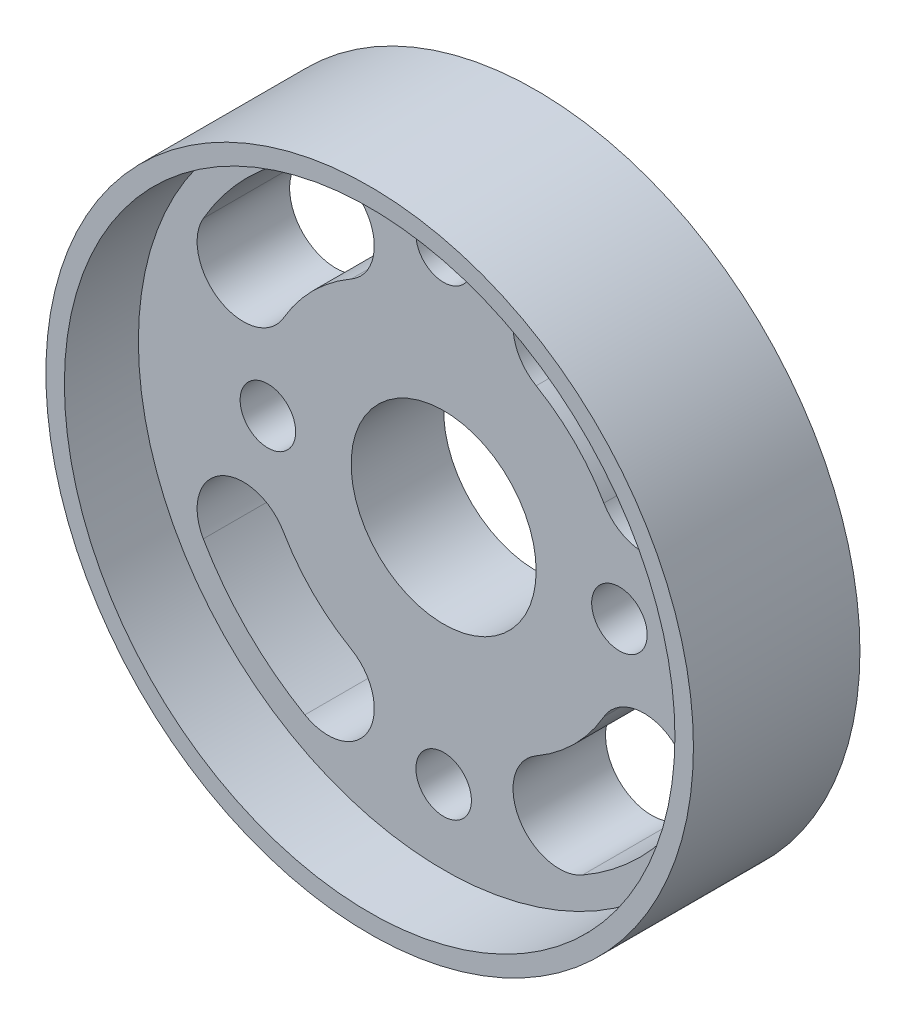
ISO-10303-21;
HEADER;
FILE_DESCRIPTION(('STEP AP214'),'2;1');
FILE_NAME('part.step','',(''),(''),'','','');
FILE_SCHEMA(('AUTOMOTIVE_DESIGN { 1 0 10303 214 1 1 1 1 }'));
ENDSEC;
DATA;
#1=APPLICATION_CONTEXT('core data for automotive mechanical design processes');
#2=APPLICATION_PROTOCOL_DEFINITION('international standard','automotive_design',2000,#1);
#3=PRODUCT_CONTEXT('',#1,'mechanical');
#4=PRODUCT('Part','Part','',(#3));
#5=PRODUCT_RELATED_PRODUCT_CATEGORY('part','',(#4));
#6=PRODUCT_DEFINITION_FORMATION('','',#4);
#7=PRODUCT_DEFINITION_CONTEXT('part definition',#1,'design');
#8=PRODUCT_DEFINITION('design','',#6,#7);
#9=PRODUCT_DEFINITION_SHAPE('','',#8);
#10=(LENGTH_UNIT() NAMED_UNIT(*) SI_UNIT(.MILLI.,.METRE.));
#11=(NAMED_UNIT(*) PLANE_ANGLE_UNIT() SI_UNIT($,.RADIAN.));
#12=(NAMED_UNIT(*) SI_UNIT($,.STERADIAN.) SOLID_ANGLE_UNIT());
#13=UNCERTAINTY_MEASURE_WITH_UNIT(LENGTH_MEASURE(1.E-05),#10,'distance_accuracy_value','');
#14=(GEOMETRIC_REPRESENTATION_CONTEXT(3) GLOBAL_UNCERTAINTY_ASSIGNED_CONTEXT((#13)) GLOBAL_UNIT_ASSIGNED_CONTEXT((#10,
#11,#12)) REPRESENTATION_CONTEXT('',''));
#15=CARTESIAN_POINT('',(0.,0.,0.));
#16=DIRECTION('',(0.,0.,1.));
#17=DIRECTION('',(1.,0.,0.));
#18=AXIS2_PLACEMENT_3D('',#15,#16,#17);
#19=CARTESIAN_POINT('',(0.,0.,5.));
#20=DIRECTION('',(0.,0.,1.));
#21=DIRECTION('',(1.,0.,0.));
#22=AXIS2_PLACEMENT_3D('',#19,#20,#21);
#23=PLANE('',#22);
#24=CARTESIAN_POINT('',(-9.5,0.,5.));
#25=DIRECTION('',(0.,0.,1.));
#26=DIRECTION('',(1.,0.,0.));
#27=AXIS2_PLACEMENT_3D('',#24,#25,#26);
#28=CIRCLE('',#27,1.5);
#29=CARTESIAN_POINT('',(-8.,0.,5.));
#30=VERTEX_POINT('',#29);
#31=EDGE_CURVE('E325',#30,#30,#28,.T.);
#32=ORIENTED_EDGE('',*,*,#31,.F.);
#33=EDGE_LOOP('',(#32));
#34=FACE_BOUND('',#33,.T.);
#35=CARTESIAN_POINT('',(6.25000000000001,10.8253175473055,5.));
#36=DIRECTION('',(0.,0.,1.));
#37=DIRECTION('',(-1.,0.,0.));
#38=AXIS2_PLACEMENT_3D('',#35,#36,#37);
#39=CIRCLE('',#38,2.5);
#40=CARTESIAN_POINT('',(7.50000000000001,12.9903810567666,5.));
#41=VERTEX_POINT('',#40);
#42=CARTESIAN_POINT('',(5.00000000000001,8.66025403784438,5.));
#43=VERTEX_POINT('',#42);
#44=EDGE_CURVE('E160',#41,#43,#39,.T.);
#45=ORIENTED_EDGE('',*,*,#44,.F.);
#46=CARTESIAN_POINT('',(0.,0.,5.));
#47=DIRECTION('',(0.,0.,1.));
#48=DIRECTION('',(1.,0.,0.));
#49=AXIS2_PLACEMENT_3D('',#46,#47,#48);
#50=CIRCLE('',#49,15.);
#51=CARTESIAN_POINT('',(12.9903810567668,7.49999999999964,5.));
#52=VERTEX_POINT('',#51);
#53=EDGE_CURVE('E152',#52,#41,#50,.T.);
#54=ORIENTED_EDGE('',*,*,#53,.F.);
#55=CARTESIAN_POINT('',(10.8253175473056,6.24999999999969,5.));
#56=DIRECTION('',(0.,0.,1.));
#57=DIRECTION('',(-1.,0.,0.));
#58=AXIS2_PLACEMENT_3D('',#55,#56,#57);
#59=CIRCLE('',#58,2.5);
#60=CARTESIAN_POINT('',(8.66025403784451,4.99999999999975,5.));
#61=VERTEX_POINT('',#60);
#62=EDGE_CURVE('E175',#61,#52,#59,.T.);
#63=ORIENTED_EDGE('',*,*,#62,.F.);
#64=CARTESIAN_POINT('',(0.,0.,5.));
#65=DIRECTION('',(0.,0.,-1.));
#66=DIRECTION('',(1.,0.,0.));
#67=AXIS2_PLACEMENT_3D('',#64,#65,#66);
#68=CIRCLE('',#67,10.);
#69=EDGE_CURVE('E173',#43,#61,#68,.T.);
#70=ORIENTED_EDGE('',*,*,#69,.F.);
#71=EDGE_LOOP('',(#45,#54,#63,#70));
#72=FACE_BOUND('',#71,.T.);
#73=CARTESIAN_POINT('',(6.24999999999979,-10.8253175473056,5.));
#74=DIRECTION('',(0.,0.,1.));
#75=DIRECTION('',(1.,0.,0.));
#76=AXIS2_PLACEMENT_3D('',#73,#74,#75);
#77=CIRCLE('',#76,2.5);
#78=CARTESIAN_POINT('',(4.99999999999983,-8.66025403784448,5.));
#79=VERTEX_POINT('',#78);
#80=CARTESIAN_POINT('',(7.49999999999975,-12.9903810567667,5.));
#81=VERTEX_POINT('',#80);
#82=EDGE_CURVE('E193',#79,#81,#77,.T.);
#83=ORIENTED_EDGE('',*,*,#82,.F.);
#84=CARTESIAN_POINT('',(0.,0.,5.));
#85=DIRECTION('',(0.,0.,-1.));
#86=DIRECTION('',(1.,0.,0.));
#87=AXIS2_PLACEMENT_3D('',#84,#85,#86);
#88=CIRCLE('',#87,10.);
#89=CARTESIAN_POINT('',(8.66025403784442,-4.99999999999995,5.));
#90=VERTEX_POINT('',#89);
#91=EDGE_CURVE('E191',#90,#79,#88,.T.);
#92=ORIENTED_EDGE('',*,*,#91,.F.);
#93=CARTESIAN_POINT('',(10.8253175473055,-6.24999999999993,5.));
#94=DIRECTION('',(0.,0.,1.));
#95=DIRECTION('',(1.,0.,0.));
#96=AXIS2_PLACEMENT_3D('',#93,#94,#95);
#97=CIRCLE('',#96,2.5);
#98=CARTESIAN_POINT('',(12.9903810567666,-7.49999999999991,5.));
#99=VERTEX_POINT('',#98);
#100=EDGE_CURVE('E199',#99,#90,#97,.T.);
#101=ORIENTED_EDGE('',*,*,#100,.F.);
#102=CARTESIAN_POINT('',(0.,0.,5.));
#103=DIRECTION('',(0.,0.,1.));
#104=DIRECTION('',(1.,0.,0.));
#105=AXIS2_PLACEMENT_3D('',#102,#103,#104);
#106=CIRCLE('',#105,15.);
#107=EDGE_CURVE('E196',#81,#99,#106,.T.);
#108=ORIENTED_EDGE('',*,*,#107,.F.);
#109=EDGE_LOOP('',(#83,#92,#101,#108));
#110=FACE_BOUND('',#109,.T.);
#111=CARTESIAN_POINT('',(0.,0.,5.));
#112=DIRECTION('',(0.,0.,1.));
#113=DIRECTION('',(1.,0.,0.));
#114=AXIS2_PLACEMENT_3D('',#111,#112,#113);
#115=CIRCLE('',#114,15.);
#116=CARTESIAN_POINT('',(-12.9903810567666,-7.49999999999991,5.));
#117=VERTEX_POINT('',#116);
#118=CARTESIAN_POINT('',(-7.49999999999975,-12.9903810567667,5.));
#119=VERTEX_POINT('',#118);
#120=EDGE_CURVE('E224',#117,#119,#115,.T.);
#121=ORIENTED_EDGE('',*,*,#120,.F.);
#122=CARTESIAN_POINT('',(-10.8253175473055,-6.24999999999993,5.));
#123=DIRECTION('',(0.,0.,1.));
#124=DIRECTION('',(-1.,0.,0.));
#125=AXIS2_PLACEMENT_3D('',#122,#123,#124);
#126=CIRCLE('',#125,2.5);
#127=CARTESIAN_POINT('',(-8.66025403784442,-4.99999999999994,5.));
#128=VERTEX_POINT('',#127);
#129=EDGE_CURVE('E222',#128,#117,#126,.T.);
#130=ORIENTED_EDGE('',*,*,#129,.F.);
#131=CARTESIAN_POINT('',(0.,0.,5.));
#132=DIRECTION('',(0.,0.,-1.));
#133=DIRECTION('',(1.,0.,0.));
#134=AXIS2_PLACEMENT_3D('',#131,#132,#133);
#135=CIRCLE('',#134,10.);
#136=CARTESIAN_POINT('',(-4.99999999999983,-8.66025403784448,5.));
#137=VERTEX_POINT('',#136);
#138=EDGE_CURVE('E230',#137,#128,#135,.T.);
#139=ORIENTED_EDGE('',*,*,#138,.F.);
#140=CARTESIAN_POINT('',(-6.24999999999979,-10.8253175473056,5.));
#141=DIRECTION('',(0.,0.,1.));
#142=DIRECTION('',(-1.,0.,0.));
#143=AXIS2_PLACEMENT_3D('',#140,#141,#142);
#144=CIRCLE('',#143,2.5);
#145=EDGE_CURVE('E227',#119,#137,#144,.T.);
#146=ORIENTED_EDGE('',*,*,#145,.F.);
#147=EDGE_LOOP('',(#121,#130,#139,#146));
#148=FACE_BOUND('',#147,.T.);
#149=CARTESIAN_POINT('',(-6.25000000000002,10.8253175473055,5.));
#150=DIRECTION('',(0.,0.,1.));
#151=DIRECTION('',(1.,0.,0.));
#152=AXIS2_PLACEMENT_3D('',#149,#150,#151);
#153=CIRCLE('',#152,2.5);
#154=CARTESIAN_POINT('',(-5.00000000000002,8.66025403784438,5.));
#155=VERTEX_POINT('',#154);
#156=CARTESIAN_POINT('',(-7.50000000000002,12.9903810567666,5.));
#157=VERTEX_POINT('',#156);
#158=EDGE_CURVE('E255',#155,#157,#153,.T.);
#159=ORIENTED_EDGE('',*,*,#158,.F.);
#160=CARTESIAN_POINT('',(0.,0.,5.));
#161=DIRECTION('',(0.,0.,-1.));
#162=DIRECTION('',(1.,0.,0.));
#163=AXIS2_PLACEMENT_3D('',#160,#161,#162);
#164=CIRCLE('',#163,10.);
#165=CARTESIAN_POINT('',(-8.66025403784453,4.99999999999976,5.));
#166=VERTEX_POINT('',#165);
#167=EDGE_CURVE('E253',#166,#155,#164,.T.);
#168=ORIENTED_EDGE('',*,*,#167,.F.);
#169=CARTESIAN_POINT('',(-10.8253175473057,6.24999999999971,5.));
#170=DIRECTION('',(0.,0.,1.));
#171=DIRECTION('',(1.,0.,0.));
#172=AXIS2_PLACEMENT_3D('',#169,#170,#171);
#173=CIRCLE('',#172,2.5);
#174=CARTESIAN_POINT('',(-12.9903810567668,7.49999999999965,5.));
#175=VERTEX_POINT('',#174);
#176=EDGE_CURVE('E261',#175,#166,#173,.T.);
#177=ORIENTED_EDGE('',*,*,#176,.F.);
#178=CARTESIAN_POINT('',(0.,0.,5.));
#179=DIRECTION('',(0.,0.,1.));
#180=DIRECTION('',(1.,0.,0.));
#181=AXIS2_PLACEMENT_3D('',#178,#179,#180);
#182=CIRCLE('',#181,15.);
#183=EDGE_CURVE('E258',#157,#175,#182,.T.);
#184=ORIENTED_EDGE('',*,*,#183,.F.);
#185=EDGE_LOOP('',(#159,#168,#177,#184));
#186=FACE_BOUND('',#185,.T.);
#187=CARTESIAN_POINT('',(7.13032233885358E-13,-12.5,5.));
#188=DIRECTION('',(0.,0.,1.));
#189=DIRECTION('',(1.,0.,0.));
#190=AXIS2_PLACEMENT_3D('',#187,#188,#189);
#191=CIRCLE('',#190,1.50000000000077);
#192=CARTESIAN_POINT('',(1.50000000000148,-12.5,5.));
#193=VERTEX_POINT('',#192);
#194=EDGE_CURVE('E284',#193,#193,#191,.T.);
#195=ORIENTED_EDGE('',*,*,#194,.F.);
#196=EDGE_LOOP('',(#195));
#197=FACE_BOUND('',#196,.T.);
#198=CARTESIAN_POINT('',(0.,12.5,5.));
#199=DIRECTION('',(0.,0.,1.));
#200=DIRECTION('',(1.,0.,0.));
#201=AXIS2_PLACEMENT_3D('',#198,#199,#200);
#202=CIRCLE('',#201,1.5);
#203=CARTESIAN_POINT('',(1.5,12.5,5.));
#204=VERTEX_POINT('',#203);
#205=EDGE_CURVE('E296',#204,#204,#202,.T.);
#206=ORIENTED_EDGE('',*,*,#205,.F.);
#207=EDGE_LOOP('',(#206));
#208=FACE_BOUND('',#207,.T.);
#209=CARTESIAN_POINT('',(0.,0.,5.));
#210=DIRECTION('',(0.,0.,1.));
#211=DIRECTION('',(1.,0.,0.));
#212=AXIS2_PLACEMENT_3D('',#209,#210,#211);
#213=CIRCLE('',#212,5.);
#214=CARTESIAN_POINT('',(5.,0.,5.));
#215=VERTEX_POINT('',#214);
#216=EDGE_CURVE('E290',#215,#215,#213,.T.);
#217=ORIENTED_EDGE('',*,*,#216,.F.);
#218=EDGE_LOOP('',(#217));
#219=FACE_BOUND('',#218,.T.);
#220=CARTESIAN_POINT('',(9.5,0.,5.));
#221=DIRECTION('',(0.,0.,1.));
#222=DIRECTION('',(1.,0.,0.));
#223=AXIS2_PLACEMENT_3D('',#220,#221,#222);
#224=CIRCLE('',#223,1.5);
#225=CARTESIAN_POINT('',(11.,0.,5.));
#226=VERTEX_POINT('',#225);
#227=EDGE_CURVE('E181',#226,#226,#224,.T.);
#228=ORIENTED_EDGE('',*,*,#227,.F.);
#229=EDGE_LOOP('',(#228));
#230=FACE_BOUND('',#229,.T.);
#231=CARTESIAN_POINT('',(0.,0.,5.));
#232=DIRECTION('',(0.,0.,1.));
#233=DIRECTION('',(1.,0.,0.));
#234=AXIS2_PLACEMENT_3D('',#231,#232,#233);
#235=CIRCLE('',#234,16.5);
#236=CARTESIAN_POINT('',(16.5,0.,5.));
#237=VERTEX_POINT('',#236);
#238=EDGE_CURVE('E12',#237,#237,#235,.F.);
#239=ORIENTED_EDGE('',*,*,#238,.F.);
#240=EDGE_LOOP('',(#239));
#241=FACE_BOUND('',#240,.T.);
#242=ADVANCED_FACE('F39',(#34,#72,#110,#148,#186,#197,#208,#219,#230,#241),#23,.T.);
#243=CARTESIAN_POINT('',(0.,0.,0.));
#244=DIRECTION('',(0.,0.,1.));
#245=DIRECTION('',(1.,0.,0.));
#246=AXIS2_PLACEMENT_3D('',#243,#244,#245);
#247=PLANE('',#246);
#248=CARTESIAN_POINT('',(0.,0.,0.));
#249=DIRECTION('',(0.,0.,-1.));
#250=DIRECTION('',(1.,0.,0.));
#251=AXIS2_PLACEMENT_3D('',#248,#249,#250);
#252=CIRCLE('',#251,10.);
#253=CARTESIAN_POINT('',(8.66025403784442,-4.99999999999995,0.));
#254=VERTEX_POINT('',#253);
#255=CARTESIAN_POINT('',(4.99999999999983,-8.66025403784448,0.));
#256=VERTEX_POINT('',#255);
#257=EDGE_CURVE('E168',#254,#256,#252,.T.);
#258=ORIENTED_EDGE('',*,*,#257,.T.);
#259=CARTESIAN_POINT('',(6.24999999999979,-10.8253175473056,0.));
#260=DIRECTION('',(0.,0.,1.));
#261=DIRECTION('',(1.,0.,0.));
#262=AXIS2_PLACEMENT_3D('',#259,#260,#261);
#263=CIRCLE('',#262,2.5);
#264=CARTESIAN_POINT('',(7.49999999999975,-12.9903810567667,0.));
#265=VERTEX_POINT('',#264);
#266=EDGE_CURVE('E204',#256,#265,#263,.T.);
#267=ORIENTED_EDGE('',*,*,#266,.T.);
#268=CARTESIAN_POINT('',(0.,0.,0.));
#269=DIRECTION('',(0.,0.,1.));
#270=DIRECTION('',(1.,0.,0.));
#271=AXIS2_PLACEMENT_3D('',#268,#269,#270);
#272=CIRCLE('',#271,15.);
#273=CARTESIAN_POINT('',(12.9903810567666,-7.49999999999991,0.));
#274=VERTEX_POINT('',#273);
#275=EDGE_CURVE('E207',#265,#274,#272,.T.);
#276=ORIENTED_EDGE('',*,*,#275,.T.);
#277=CARTESIAN_POINT('',(10.8253175473055,-6.24999999999993,0.));
#278=DIRECTION('',(0.,0.,1.));
#279=DIRECTION('',(1.,0.,0.));
#280=AXIS2_PLACEMENT_3D('',#277,#278,#279);
#281=CIRCLE('',#280,2.5);
#282=EDGE_CURVE('E194',#274,#254,#281,.T.);
#283=ORIENTED_EDGE('',*,*,#282,.T.);
#284=EDGE_LOOP('',(#258,#267,#276,#283));
#285=FACE_BOUND('',#284,.T.);
#286=CARTESIAN_POINT('',(0.,0.,0.));
#287=DIRECTION('',(0.,0.,-1.));
#288=DIRECTION('',(1.,0.,0.));
#289=AXIS2_PLACEMENT_3D('',#286,#287,#288);
#290=CIRCLE('',#289,10.);
#291=CARTESIAN_POINT('',(-8.66025403784453,4.99999999999976,0.));
#292=VERTEX_POINT('',#291);
#293=CARTESIAN_POINT('',(-5.00000000000002,8.66025403784438,0.));
#294=VERTEX_POINT('',#293);
#295=EDGE_CURVE('E252',#292,#294,#290,.T.);
#296=ORIENTED_EDGE('',*,*,#295,.T.);
#297=CARTESIAN_POINT('',(-6.25000000000002,10.8253175473055,0.));
#298=DIRECTION('',(0.,0.,1.));
#299=DIRECTION('',(1.,0.,0.));
#300=AXIS2_PLACEMENT_3D('',#297,#298,#299);
#301=CIRCLE('',#300,2.5);
#302=CARTESIAN_POINT('',(-7.50000000000002,12.9903810567666,0.));
#303=VERTEX_POINT('',#302);
#304=EDGE_CURVE('E266',#294,#303,#301,.T.);
#305=ORIENTED_EDGE('',*,*,#304,.T.);
#306=CARTESIAN_POINT('',(0.,0.,0.));
#307=DIRECTION('',(0.,0.,1.));
#308=DIRECTION('',(1.,0.,0.));
#309=AXIS2_PLACEMENT_3D('',#306,#307,#308);
#310=CIRCLE('',#309,15.);
#311=CARTESIAN_POINT('',(-12.9903810567668,7.49999999999965,0.));
#312=VERTEX_POINT('',#311);
#313=EDGE_CURVE('E269',#303,#312,#310,.T.);
#314=ORIENTED_EDGE('',*,*,#313,.T.);
#315=CARTESIAN_POINT('',(-10.8253175473057,6.24999999999971,0.));
#316=DIRECTION('',(0.,0.,1.));
#317=DIRECTION('',(1.,0.,0.));
#318=AXIS2_PLACEMENT_3D('',#315,#316,#317);
#319=CIRCLE('',#318,2.5);
#320=EDGE_CURVE('E256',#312,#292,#319,.T.);
#321=ORIENTED_EDGE('',*,*,#320,.T.);
#322=EDGE_LOOP('',(#296,#305,#314,#321));
#323=FACE_BOUND('',#322,.T.);
#324=CARTESIAN_POINT('',(0.,0.,0.));
#325=DIRECTION('',(0.,0.,1.));
#326=DIRECTION('',(1.,0.,0.));
#327=AXIS2_PLACEMENT_3D('',#324,#325,#326);
#328=CIRCLE('',#327,17.5);
#329=CARTESIAN_POINT('',(17.5,0.,0.));
#330=VERTEX_POINT('',#329);
#331=EDGE_CURVE('E47',#330,#330,#328,.T.);
#332=ORIENTED_EDGE('',*,*,#331,.F.);
#333=EDGE_LOOP('',(#332));
#334=FACE_BOUND('',#333,.T.);
#335=CARTESIAN_POINT('',(0.,12.5,0.));
#336=DIRECTION('',(0.,0.,1.));
#337=DIRECTION('',(1.,0.,0.));
#338=AXIS2_PLACEMENT_3D('',#335,#336,#337);
#339=CIRCLE('',#338,1.5);
#340=CARTESIAN_POINT('',(1.5,12.5,0.));
#341=VERTEX_POINT('',#340);
#342=EDGE_CURVE('E293',#341,#341,#339,.T.);
#343=ORIENTED_EDGE('',*,*,#342,.T.);
#344=EDGE_LOOP('',(#343));
#345=FACE_BOUND('',#344,.T.);
#346=CARTESIAN_POINT('',(0.,0.,0.));
#347=DIRECTION('',(0.,0.,1.));
#348=DIRECTION('',(1.,0.,0.));
#349=AXIS2_PLACEMENT_3D('',#346,#347,#348);
#350=CIRCLE('',#349,5.);
#351=CARTESIAN_POINT('',(5.,0.,0.));
#352=VERTEX_POINT('',#351);
#353=EDGE_CURVE('E287',#352,#352,#350,.T.);
#354=ORIENTED_EDGE('',*,*,#353,.T.);
#355=EDGE_LOOP('',(#354));
#356=FACE_BOUND('',#355,.T.);
#357=CARTESIAN_POINT('',(7.13032233885358E-13,-12.5,0.));
#358=DIRECTION('',(0.,0.,1.));
#359=DIRECTION('',(1.,0.,0.));
#360=AXIS2_PLACEMENT_3D('',#357,#358,#359);
#361=CIRCLE('',#360,1.50000000000077);
#362=CARTESIAN_POINT('',(1.50000000000148,-12.5,0.));
#363=VERTEX_POINT('',#362);
#364=EDGE_CURVE('E283',#363,#363,#361,.T.);
#365=ORIENTED_EDGE('',*,*,#364,.T.);
#366=EDGE_LOOP('',(#365));
#367=FACE_BOUND('',#366,.T.);
#368=CARTESIAN_POINT('',(-10.8253175473055,-6.24999999999993,0.));
#369=DIRECTION('',(0.,0.,1.));
#370=DIRECTION('',(-1.,0.,0.));
#371=AXIS2_PLACEMENT_3D('',#368,#369,#370);
#372=CIRCLE('',#371,2.5);
#373=CARTESIAN_POINT('',(-8.66025403784442,-4.99999999999994,0.));
#374=VERTEX_POINT('',#373);
#375=CARTESIAN_POINT('',(-12.9903810567666,-7.49999999999991,0.));
#376=VERTEX_POINT('',#375);
#377=EDGE_CURVE('E221',#374,#376,#372,.T.);
#378=ORIENTED_EDGE('',*,*,#377,.T.);
#379=CARTESIAN_POINT('',(0.,0.,0.));
#380=DIRECTION('',(0.,0.,1.));
#381=DIRECTION('',(1.,0.,0.));
#382=AXIS2_PLACEMENT_3D('',#379,#380,#381);
#383=CIRCLE('',#382,15.);
#384=CARTESIAN_POINT('',(-7.49999999999975,-12.9903810567667,0.));
#385=VERTEX_POINT('',#384);
#386=EDGE_CURVE('E235',#376,#385,#383,.T.);
#387=ORIENTED_EDGE('',*,*,#386,.T.);
#388=CARTESIAN_POINT('',(-6.24999999999979,-10.8253175473056,0.));
#389=DIRECTION('',(0.,0.,1.));
#390=DIRECTION('',(-1.,0.,0.));
#391=AXIS2_PLACEMENT_3D('',#388,#389,#390);
#392=CIRCLE('',#391,2.5);
#393=CARTESIAN_POINT('',(-4.99999999999983,-8.66025403784448,0.));
#394=VERTEX_POINT('',#393);
#395=EDGE_CURVE('E238',#385,#394,#392,.T.);
#396=ORIENTED_EDGE('',*,*,#395,.T.);
#397=CARTESIAN_POINT('',(0.,0.,0.));
#398=DIRECTION('',(0.,0.,-1.));
#399=DIRECTION('',(1.,0.,0.));
#400=AXIS2_PLACEMENT_3D('',#397,#398,#399);
#401=CIRCLE('',#400,10.);
#402=EDGE_CURVE('E225',#394,#374,#401,.T.);
#403=ORIENTED_EDGE('',*,*,#402,.T.);
#404=EDGE_LOOP('',(#378,#387,#396,#403));
#405=FACE_BOUND('',#404,.T.);
#406=CARTESIAN_POINT('',(0.,0.,0.));
#407=DIRECTION('',(0.,0.,1.));
#408=DIRECTION('',(1.,0.,0.));
#409=AXIS2_PLACEMENT_3D('',#406,#407,#408);
#410=CIRCLE('',#409,15.);
#411=CARTESIAN_POINT('',(12.9903810567668,7.49999999999964,0.));
#412=VERTEX_POINT('',#411);
#413=CARTESIAN_POINT('',(7.50000000000001,12.9903810567666,0.));
#414=VERTEX_POINT('',#413);
#415=EDGE_CURVE('E62',#412,#414,#410,.T.);
#416=ORIENTED_EDGE('',*,*,#415,.T.);
#417=CARTESIAN_POINT('',(6.25000000000001,10.8253175473055,0.));
#418=DIRECTION('',(0.,0.,1.));
#419=DIRECTION('',(-1.,0.,0.));
#420=AXIS2_PLACEMENT_3D('',#417,#418,#419);
#421=CIRCLE('',#420,2.5);
#422=CARTESIAN_POINT('',(5.00000000000001,8.66025403784438,0.));
#423=VERTEX_POINT('',#422);
#424=EDGE_CURVE('E167',#414,#423,#421,.T.);
#425=ORIENTED_EDGE('',*,*,#424,.T.);
#426=CARTESIAN_POINT('',(0.,0.,0.));
#427=DIRECTION('',(0.,0.,-1.));
#428=DIRECTION('',(1.,0.,0.));
#429=AXIS2_PLACEMENT_3D('',#426,#427,#428);
#430=CIRCLE('',#429,10.);
#431=CARTESIAN_POINT('',(8.66025403784451,4.99999999999975,0.));
#432=VERTEX_POINT('',#431);
#433=EDGE_CURVE('E183',#423,#432,#430,.T.);
#434=ORIENTED_EDGE('',*,*,#433,.T.);
#435=CARTESIAN_POINT('',(10.8253175473056,6.24999999999969,0.));
#436=DIRECTION('',(0.,0.,1.));
#437=DIRECTION('',(-1.,0.,0.));
#438=AXIS2_PLACEMENT_3D('',#435,#436,#437);
#439=CIRCLE('',#438,2.5);
#440=EDGE_CURVE('E161',#432,#412,#439,.T.);
#441=ORIENTED_EDGE('',*,*,#440,.T.);
#442=EDGE_LOOP('',(#416,#425,#434,#441));
#443=FACE_BOUND('',#442,.T.);
#444=CARTESIAN_POINT('',(9.5,0.,0.));
#445=DIRECTION('',(0.,0.,1.));
#446=DIRECTION('',(1.,0.,0.));
#447=AXIS2_PLACEMENT_3D('',#444,#445,#446);
#448=CIRCLE('',#447,1.5);
#449=CARTESIAN_POINT('',(11.,0.,0.));
#450=VERTEX_POINT('',#449);
#451=EDGE_CURVE('E320',#450,#450,#448,.T.);
#452=ORIENTED_EDGE('',*,*,#451,.T.);
#453=EDGE_LOOP('',(#452));
#454=FACE_BOUND('',#453,.T.);
#455=CARTESIAN_POINT('',(-9.5,0.,0.));
#456=DIRECTION('',(0.,0.,1.));
#457=DIRECTION('',(1.,0.,0.));
#458=AXIS2_PLACEMENT_3D('',#455,#456,#457);
#459=CIRCLE('',#458,1.5);
#460=CARTESIAN_POINT('',(-8.,0.,0.));
#461=VERTEX_POINT('',#460);
#462=EDGE_CURVE('E323',#461,#461,#459,.T.);
#463=ORIENTED_EDGE('',*,*,#462,.T.);
#464=EDGE_LOOP('',(#463));
#465=FACE_BOUND('',#464,.T.);
#466=ADVANCED_FACE('F305',(#285,#323,#334,#345,#356,#367,#405,#443,#454,#465),#247,.F.);
#467=CARTESIAN_POINT('',(0.,0.,5.));
#468=DIRECTION('',(0.,0.,-1.));
#469=DIRECTION('',(-1.,0.,0.));
#470=AXIS2_PLACEMENT_3D('',#467,#468,#469);
#471=CYLINDRICAL_SURFACE('',#470,17.5);
#472=ORIENTED_EDGE('',*,*,#331,.T.);
#473=EDGE_LOOP('',(#472));
#474=FACE_BOUND('',#473,.T.);
#475=CARTESIAN_POINT('',(0.,0.,9.));
#476=DIRECTION('',(0.,0.,1.));
#477=DIRECTION('',(1.,0.,0.));
#478=AXIS2_PLACEMENT_3D('',#475,#476,#477);
#479=CIRCLE('',#478,17.5);
#480=CARTESIAN_POINT('',(17.5,0.,9.));
#481=VERTEX_POINT('',#480);
#482=EDGE_CURVE('E326',#481,#481,#479,.T.);
#483=ORIENTED_EDGE('',*,*,#482,.F.);
#484=EDGE_LOOP('',(#483));
#485=FACE_BOUND('',#484,.T.);
#486=ADVANCED_FACE('F41',(#474,#485),#471,.T.);
#487=CARTESIAN_POINT('',(0.,12.5,5.));
#488=DIRECTION('',(0.,0.,-1.));
#489=DIRECTION('',(-1.,0.,0.));
#490=AXIS2_PLACEMENT_3D('',#487,#488,#489);
#491=CYLINDRICAL_SURFACE('',#490,1.5);
#492=ORIENTED_EDGE('',*,*,#205,.T.);
#493=EDGE_LOOP('',(#492));
#494=FACE_BOUND('',#493,.T.);
#495=ORIENTED_EDGE('',*,*,#342,.F.);
#496=EDGE_LOOP('',(#495));
#497=FACE_BOUND('',#496,.T.);
#498=ADVANCED_FACE('F430',(#494,#497),#491,.F.);
#499=CARTESIAN_POINT('',(0.,0.,5.));
#500=DIRECTION('',(0.,0.,-1.));
#501=DIRECTION('',(-1.,0.,0.));
#502=AXIS2_PLACEMENT_3D('',#499,#500,#501);
#503=CYLINDRICAL_SURFACE('',#502,5.);
#504=ORIENTED_EDGE('',*,*,#216,.T.);
#505=EDGE_LOOP('',(#504));
#506=FACE_BOUND('',#505,.T.);
#507=ORIENTED_EDGE('',*,*,#353,.F.);
#508=EDGE_LOOP('',(#507));
#509=FACE_BOUND('',#508,.T.);
#510=ADVANCED_FACE('F426',(#506,#509),#503,.F.);
#511=CARTESIAN_POINT('',(7.13032233885358E-13,-12.5,5.));
#512=DIRECTION('',(0.,0.,-1.));
#513=DIRECTION('',(-1.,0.,0.));
#514=AXIS2_PLACEMENT_3D('',#511,#512,#513);
#515=CYLINDRICAL_SURFACE('',#514,1.50000000000077);
#516=ORIENTED_EDGE('',*,*,#194,.T.);
#517=EDGE_LOOP('',(#516));
#518=FACE_BOUND('',#517,.T.);
#519=ORIENTED_EDGE('',*,*,#364,.F.);
#520=EDGE_LOOP('',(#519));
#521=FACE_BOUND('',#520,.T.);
#522=ADVANCED_FACE('F422',(#518,#521),#515,.F.);
#523=CARTESIAN_POINT('',(0.,0.,5.));
#524=DIRECTION('',(0.,0.,-1.));
#525=DIRECTION('',(-1.,0.,0.));
#526=AXIS2_PLACEMENT_3D('',#523,#524,#525);
#527=CYLINDRICAL_SURFACE('',#526,10.);
#528=ORIENTED_EDGE('',*,*,#295,.F.);
#529=DIRECTION('',(0.,0.,-1.));
#530=VECTOR('',#529,1.);
#531=CARTESIAN_POINT('',(-8.66025403784453,4.99999999999976,5.));
#532=LINE('',#531,#530);
#533=EDGE_CURVE('E263',#166,#292,#532,.T.);
#534=ORIENTED_EDGE('',*,*,#533,.F.);
#535=ORIENTED_EDGE('',*,*,#167,.T.);
#536=DIRECTION('',(0.,0.,-1.));
#537=VECTOR('',#536,1.);
#538=CARTESIAN_POINT('',(-5.00000000000002,8.66025403784438,5.));
#539=LINE('',#538,#537);
#540=EDGE_CURVE('E280',#155,#294,#539,.T.);
#541=ORIENTED_EDGE('',*,*,#540,.T.);
#542=EDGE_LOOP('',(#528,#534,#535,#541));
#543=FACE_BOUND('',#542,.T.);
#544=ADVANCED_FACE('F418',(#543),#527,.T.);
#545=CARTESIAN_POINT('',(-6.25000000000002,10.8253175473055,5.));
#546=DIRECTION('',(0.,0.,-1.));
#547=DIRECTION('',(-1.,0.,0.));
#548=AXIS2_PLACEMENT_3D('',#545,#546,#547);
#549=CYLINDRICAL_SURFACE('',#548,2.5);
#550=ORIENTED_EDGE('',*,*,#304,.F.);
#551=ORIENTED_EDGE('',*,*,#540,.F.);
#552=ORIENTED_EDGE('',*,*,#158,.T.);
#553=DIRECTION('',(0.,0.,-1.));
#554=VECTOR('',#553,1.);
#555=CARTESIAN_POINT('',(-7.50000000000002,12.9903810567666,5.));
#556=LINE('',#555,#554);
#557=EDGE_CURVE('E278',#157,#303,#556,.T.);
#558=ORIENTED_EDGE('',*,*,#557,.T.);
#559=EDGE_LOOP('',(#550,#551,#552,#558));
#560=FACE_BOUND('',#559,.T.);
#561=ADVANCED_FACE('F414',(#560),#549,.F.);
#562=CARTESIAN_POINT('',(0.,0.,5.));
#563=DIRECTION('',(0.,0.,-1.));
#564=DIRECTION('',(-1.,0.,0.));
#565=AXIS2_PLACEMENT_3D('',#562,#563,#564);
#566=CYLINDRICAL_SURFACE('',#565,15.);
#567=ORIENTED_EDGE('',*,*,#313,.F.);
#568=ORIENTED_EDGE('',*,*,#557,.F.);
#569=ORIENTED_EDGE('',*,*,#183,.T.);
#570=DIRECTION('',(0.,0.,-1.));
#571=VECTOR('',#570,1.);
#572=CARTESIAN_POINT('',(-12.9903810567668,7.49999999999965,5.));
#573=LINE('',#572,#571);
#574=EDGE_CURVE('E276',#175,#312,#573,.T.);
#575=ORIENTED_EDGE('',*,*,#574,.T.);
#576=EDGE_LOOP('',(#567,#568,#569,#575));
#577=FACE_BOUND('',#576,.T.);
#578=ADVANCED_FACE('F410',(#577),#566,.F.);
#579=CARTESIAN_POINT('',(-10.8253175473057,6.24999999999971,5.));
#580=DIRECTION('',(0.,0.,-1.));
#581=DIRECTION('',(-1.,0.,0.));
#582=AXIS2_PLACEMENT_3D('',#579,#580,#581);
#583=CYLINDRICAL_SURFACE('',#582,2.5);
#584=ORIENTED_EDGE('',*,*,#320,.F.);
#585=ORIENTED_EDGE('',*,*,#574,.F.);
#586=ORIENTED_EDGE('',*,*,#176,.T.);
#587=ORIENTED_EDGE('',*,*,#533,.T.);
#588=EDGE_LOOP('',(#584,#585,#586,#587));
#589=FACE_BOUND('',#588,.T.);
#590=ADVANCED_FACE('F406',(#589),#583,.F.);
#591=CARTESIAN_POINT('',(-10.8253175473055,-6.24999999999993,5.));
#592=DIRECTION('',(0.,0.,-1.));
#593=DIRECTION('',(-1.,0.,0.));
#594=AXIS2_PLACEMENT_3D('',#591,#592,#593);
#595=CYLINDRICAL_SURFACE('',#594,2.5);
#596=ORIENTED_EDGE('',*,*,#377,.F.);
#597=DIRECTION('',(0.,0.,-1.));
#598=VECTOR('',#597,1.);
#599=CARTESIAN_POINT('',(-8.66025403784442,-4.99999999999994,5.));
#600=LINE('',#599,#598);
#601=EDGE_CURVE('E232',#128,#374,#600,.T.);
#602=ORIENTED_EDGE('',*,*,#601,.F.);
#603=ORIENTED_EDGE('',*,*,#129,.T.);
#604=DIRECTION('',(0.,0.,-1.));
#605=VECTOR('',#604,1.);
#606=CARTESIAN_POINT('',(-12.9903810567666,-7.49999999999991,5.));
#607=LINE('',#606,#605);
#608=EDGE_CURVE('E249',#117,#376,#607,.T.);
#609=ORIENTED_EDGE('',*,*,#608,.T.);
#610=EDGE_LOOP('',(#596,#602,#603,#609));
#611=FACE_BOUND('',#610,.T.);
#612=ADVANCED_FACE('F402',(#611),#595,.F.);
#613=CARTESIAN_POINT('',(0.,0.,5.));
#614=DIRECTION('',(0.,0.,-1.));
#615=DIRECTION('',(-1.,0.,0.));
#616=AXIS2_PLACEMENT_3D('',#613,#614,#615);
#617=CYLINDRICAL_SURFACE('',#616,15.);
#618=ORIENTED_EDGE('',*,*,#386,.F.);
#619=ORIENTED_EDGE('',*,*,#608,.F.);
#620=ORIENTED_EDGE('',*,*,#120,.T.);
#621=DIRECTION('',(0.,0.,-1.));
#622=VECTOR('',#621,1.);
#623=CARTESIAN_POINT('',(-7.49999999999975,-12.9903810567667,5.));
#624=LINE('',#623,#622);
#625=EDGE_CURVE('E247',#119,#385,#624,.T.);
#626=ORIENTED_EDGE('',*,*,#625,.T.);
#627=EDGE_LOOP('',(#618,#619,#620,#626));
#628=FACE_BOUND('',#627,.T.);
#629=ADVANCED_FACE('F398',(#628),#617,.F.);
#630=CARTESIAN_POINT('',(-6.24999999999979,-10.8253175473056,5.));
#631=DIRECTION('',(0.,0.,-1.));
#632=DIRECTION('',(-1.,0.,0.));
#633=AXIS2_PLACEMENT_3D('',#630,#631,#632);
#634=CYLINDRICAL_SURFACE('',#633,2.5);
#635=ORIENTED_EDGE('',*,*,#395,.F.);
#636=ORIENTED_EDGE('',*,*,#625,.F.);
#637=ORIENTED_EDGE('',*,*,#145,.T.);
#638=DIRECTION('',(0.,0.,-1.));
#639=VECTOR('',#638,1.);
#640=CARTESIAN_POINT('',(-4.99999999999983,-8.66025403784448,5.));
#641=LINE('',#640,#639);
#642=EDGE_CURVE('E245',#137,#394,#641,.T.);
#643=ORIENTED_EDGE('',*,*,#642,.T.);
#644=EDGE_LOOP('',(#635,#636,#637,#643));
#645=FACE_BOUND('',#644,.T.);
#646=ADVANCED_FACE('F394',(#645),#634,.F.);
#647=CARTESIAN_POINT('',(0.,0.,5.));
#648=DIRECTION('',(0.,0.,-1.));
#649=DIRECTION('',(-1.,0.,0.));
#650=AXIS2_PLACEMENT_3D('',#647,#648,#649);
#651=CYLINDRICAL_SURFACE('',#650,10.);
#652=ORIENTED_EDGE('',*,*,#402,.F.);
#653=ORIENTED_EDGE('',*,*,#642,.F.);
#654=ORIENTED_EDGE('',*,*,#138,.T.);
#655=ORIENTED_EDGE('',*,*,#601,.T.);
#656=EDGE_LOOP('',(#652,#653,#654,#655));
#657=FACE_BOUND('',#656,.T.);
#658=ADVANCED_FACE('F390',(#657),#651,.T.);
#659=CARTESIAN_POINT('',(0.,0.,5.));
#660=DIRECTION('',(0.,0.,-1.));
#661=DIRECTION('',(-1.,0.,0.));
#662=AXIS2_PLACEMENT_3D('',#659,#660,#661);
#663=CYLINDRICAL_SURFACE('',#662,10.);
#664=ORIENTED_EDGE('',*,*,#257,.F.);
#665=DIRECTION('',(0.,0.,-1.));
#666=VECTOR('',#665,1.);
#667=CARTESIAN_POINT('',(8.66025403784442,-4.99999999999995,5.));
#668=LINE('',#667,#666);
#669=EDGE_CURVE('E201',#90,#254,#668,.T.);
#670=ORIENTED_EDGE('',*,*,#669,.F.);
#671=ORIENTED_EDGE('',*,*,#91,.T.);
#672=DIRECTION('',(0.,0.,-1.));
#673=VECTOR('',#672,1.);
#674=CARTESIAN_POINT('',(4.99999999999983,-8.66025403784448,5.));
#675=LINE('',#674,#673);
#676=EDGE_CURVE('E218',#79,#256,#675,.T.);
#677=ORIENTED_EDGE('',*,*,#676,.T.);
#678=EDGE_LOOP('',(#664,#670,#671,#677));
#679=FACE_BOUND('',#678,.T.);
#680=ADVANCED_FACE('F386',(#679),#663,.T.);
#681=CARTESIAN_POINT('',(6.24999999999979,-10.8253175473056,5.));
#682=DIRECTION('',(0.,0.,-1.));
#683=DIRECTION('',(-1.,0.,0.));
#684=AXIS2_PLACEMENT_3D('',#681,#682,#683);
#685=CYLINDRICAL_SURFACE('',#684,2.5);
#686=ORIENTED_EDGE('',*,*,#266,.F.);
#687=ORIENTED_EDGE('',*,*,#676,.F.);
#688=ORIENTED_EDGE('',*,*,#82,.T.);
#689=DIRECTION('',(0.,0.,-1.));
#690=VECTOR('',#689,1.);
#691=CARTESIAN_POINT('',(7.49999999999975,-12.9903810567667,5.));
#692=LINE('',#691,#690);
#693=EDGE_CURVE('E216',#81,#265,#692,.T.);
#694=ORIENTED_EDGE('',*,*,#693,.T.);
#695=EDGE_LOOP('',(#686,#687,#688,#694));
#696=FACE_BOUND('',#695,.T.);
#697=ADVANCED_FACE('F382',(#696),#685,.F.);
#698=CARTESIAN_POINT('',(0.,0.,5.));
#699=DIRECTION('',(0.,0.,-1.));
#700=DIRECTION('',(-1.,0.,0.));
#701=AXIS2_PLACEMENT_3D('',#698,#699,#700);
#702=CYLINDRICAL_SURFACE('',#701,15.);
#703=ORIENTED_EDGE('',*,*,#275,.F.);
#704=ORIENTED_EDGE('',*,*,#693,.F.);
#705=ORIENTED_EDGE('',*,*,#107,.T.);
#706=DIRECTION('',(0.,0.,-1.));
#707=VECTOR('',#706,1.);
#708=CARTESIAN_POINT('',(12.9903810567666,-7.49999999999991,5.));
#709=LINE('',#708,#707);
#710=EDGE_CURVE('E214',#99,#274,#709,.T.);
#711=ORIENTED_EDGE('',*,*,#710,.T.);
#712=EDGE_LOOP('',(#703,#704,#705,#711));
#713=FACE_BOUND('',#712,.T.);
#714=ADVANCED_FACE('F378',(#713),#702,.F.);
#715=CARTESIAN_POINT('',(10.8253175473055,-6.24999999999993,5.));
#716=DIRECTION('',(0.,0.,-1.));
#717=DIRECTION('',(-1.,0.,0.));
#718=AXIS2_PLACEMENT_3D('',#715,#716,#717);
#719=CYLINDRICAL_SURFACE('',#718,2.5);
#720=ORIENTED_EDGE('',*,*,#282,.F.);
#721=ORIENTED_EDGE('',*,*,#710,.F.);
#722=ORIENTED_EDGE('',*,*,#100,.T.);
#723=ORIENTED_EDGE('',*,*,#669,.T.);
#724=EDGE_LOOP('',(#720,#721,#722,#723));
#725=FACE_BOUND('',#724,.T.);
#726=ADVANCED_FACE('F375',(#725),#719,.F.);
#727=CARTESIAN_POINT('',(0.,0.,5.));
#728=DIRECTION('',(0.,0.,-1.));
#729=DIRECTION('',(-1.,0.,0.));
#730=AXIS2_PLACEMENT_3D('',#727,#728,#729);
#731=CYLINDRICAL_SURFACE('',#730,15.);
#732=ORIENTED_EDGE('',*,*,#415,.F.);
#733=DIRECTION('',(0.,0.,-1.));
#734=VECTOR('',#733,1.);
#735=CARTESIAN_POINT('',(12.9903810567668,7.49999999999964,5.));
#736=LINE('',#735,#734);
#737=EDGE_CURVE('E156',#52,#412,#736,.T.);
#738=ORIENTED_EDGE('',*,*,#737,.F.);
#739=ORIENTED_EDGE('',*,*,#53,.T.);
#740=DIRECTION('',(0.,0.,-1.));
#741=VECTOR('',#740,1.);
#742=CARTESIAN_POINT('',(7.50000000000001,12.9903810567666,5.));
#743=LINE('',#742,#741);
#744=EDGE_CURVE('E155',#41,#414,#743,.T.);
#745=ORIENTED_EDGE('',*,*,#744,.T.);
#746=EDGE_LOOP('',(#732,#738,#739,#745));
#747=FACE_BOUND('',#746,.T.);
#748=ADVANCED_FACE('F154',(#747),#731,.F.);
#749=CARTESIAN_POINT('',(6.25000000000001,10.8253175473055,5.));
#750=DIRECTION('',(0.,0.,-1.));
#751=DIRECTION('',(-1.,0.,0.));
#752=AXIS2_PLACEMENT_3D('',#749,#750,#751);
#753=CYLINDRICAL_SURFACE('',#752,2.5);
#754=ORIENTED_EDGE('',*,*,#424,.F.);
#755=ORIENTED_EDGE('',*,*,#744,.F.);
#756=ORIENTED_EDGE('',*,*,#44,.T.);
#757=DIRECTION('',(0.,0.,-1.));
#758=VECTOR('',#757,1.);
#759=CARTESIAN_POINT('',(5.00000000000001,8.66025403784438,5.));
#760=LINE('',#759,#758);
#761=EDGE_CURVE('E169',#43,#423,#760,.T.);
#762=ORIENTED_EDGE('',*,*,#761,.T.);
#763=EDGE_LOOP('',(#754,#755,#756,#762));
#764=FACE_BOUND('',#763,.T.);
#765=ADVANCED_FACE('F164',(#764),#753,.F.);
#766=CARTESIAN_POINT('',(0.,0.,5.));
#767=DIRECTION('',(0.,0.,-1.));
#768=DIRECTION('',(-1.,0.,0.));
#769=AXIS2_PLACEMENT_3D('',#766,#767,#768);
#770=CYLINDRICAL_SURFACE('',#769,10.);
#771=ORIENTED_EDGE('',*,*,#433,.F.);
#772=ORIENTED_EDGE('',*,*,#761,.F.);
#773=ORIENTED_EDGE('',*,*,#69,.T.);
#774=DIRECTION('',(0.,0.,-1.));
#775=VECTOR('',#774,1.);
#776=CARTESIAN_POINT('',(8.66025403784451,4.99999999999975,5.));
#777=LINE('',#776,#775);
#778=EDGE_CURVE('E54',#61,#432,#777,.T.);
#779=ORIENTED_EDGE('',*,*,#778,.T.);
#780=EDGE_LOOP('',(#771,#772,#773,#779));
#781=FACE_BOUND('',#780,.T.);
#782=ADVANCED_FACE('F367',(#781),#770,.T.);
#783=CARTESIAN_POINT('',(10.8253175473056,6.24999999999969,5.));
#784=DIRECTION('',(0.,0.,-1.));
#785=DIRECTION('',(-1.,0.,0.));
#786=AXIS2_PLACEMENT_3D('',#783,#784,#785);
#787=CYLINDRICAL_SURFACE('',#786,2.5);
#788=ORIENTED_EDGE('',*,*,#440,.F.);
#789=ORIENTED_EDGE('',*,*,#778,.F.);
#790=ORIENTED_EDGE('',*,*,#62,.T.);
#791=ORIENTED_EDGE('',*,*,#737,.T.);
#792=EDGE_LOOP('',(#788,#789,#790,#791));
#793=FACE_BOUND('',#792,.T.);
#794=ADVANCED_FACE('F364',(#793),#787,.F.);
#795=CARTESIAN_POINT('',(9.5,0.,5.));
#796=DIRECTION('',(0.,0.,-1.));
#797=DIRECTION('',(-1.,0.,0.));
#798=AXIS2_PLACEMENT_3D('',#795,#796,#797);
#799=CYLINDRICAL_SURFACE('',#798,1.5);
#800=ORIENTED_EDGE('',*,*,#227,.T.);
#801=EDGE_LOOP('',(#800));
#802=FACE_BOUND('',#801,.T.);
#803=ORIENTED_EDGE('',*,*,#451,.F.);
#804=EDGE_LOOP('',(#803));
#805=FACE_BOUND('',#804,.T.);
#806=ADVANCED_FACE('F337',(#802,#805),#799,.F.);
#807=CARTESIAN_POINT('',(-9.5,0.,5.));
#808=DIRECTION('',(0.,0.,-1.));
#809=DIRECTION('',(-1.,0.,0.));
#810=AXIS2_PLACEMENT_3D('',#807,#808,#809);
#811=CYLINDRICAL_SURFACE('',#810,1.5);
#812=ORIENTED_EDGE('',*,*,#31,.T.);
#813=EDGE_LOOP('',(#812));
#814=FACE_BOUND('',#813,.T.);
#815=ORIENTED_EDGE('',*,*,#462,.F.);
#816=EDGE_LOOP('',(#815));
#817=FACE_BOUND('',#816,.T.);
#818=ADVANCED_FACE('F354',(#814,#817),#811,.F.);
#819=CARTESIAN_POINT('',(0.,0.,9.));
#820=DIRECTION('',(0.,0.,1.));
#821=DIRECTION('',(1.,0.,0.));
#822=AXIS2_PLACEMENT_3D('',#819,#820,#821);
#823=PLANE('',#822);
#824=ORIENTED_EDGE('',*,*,#482,.T.);
#825=EDGE_LOOP('',(#824));
#826=FACE_BOUND('',#825,.T.);
#827=CARTESIAN_POINT('',(0.,0.,9.));
#828=DIRECTION('',(0.,0.,1.));
#829=DIRECTION('',(1.,0.,0.));
#830=AXIS2_PLACEMENT_3D('',#827,#828,#829);
#831=CIRCLE('',#830,16.5);
#832=CARTESIAN_POINT('',(16.5,0.,9.));
#833=VERTEX_POINT('',#832);
#834=EDGE_CURVE('E331',#833,#833,#831,.T.);
#835=ORIENTED_EDGE('',*,*,#834,.F.);
#836=EDGE_LOOP('',(#835));
#837=FACE_BOUND('',#836,.T.);
#838=ADVANCED_FACE('F348',(#826,#837),#823,.T.);
#839=CARTESIAN_POINT('',(0.,0.,9.));
#840=DIRECTION('',(0.,0.,-1.));
#841=DIRECTION('',(-1.,0.,0.));
#842=AXIS2_PLACEMENT_3D('',#839,#840,#841);
#843=CYLINDRICAL_SURFACE('',#842,16.5);
#844=ORIENTED_EDGE('',*,*,#834,.T.);
#845=EDGE_LOOP('',(#844));
#846=FACE_BOUND('',#845,.T.);
#847=ORIENTED_EDGE('',*,*,#238,.T.);
#848=EDGE_LOOP('',(#847));
#849=FACE_BOUND('',#848,.T.);
#850=ADVANCED_FACE('F346',(#846,#849),#843,.F.);
#851=CLOSED_SHELL('',(#242,#466,#486,#498,#510,#522,#544,#561,#578,#590,#612,#629,#646,#658,
#680,#697,#714,#726,#748,#765,#782,#794,#806,#818,#838,#850));
#852=MANIFOLD_SOLID_BREP('B2',#851);
#853=ADVANCED_BREP_SHAPE_REPRESENTATION('',(#18,#852),#14);
#854=SHAPE_DEFINITION_REPRESENTATION(#9,#853);
ENDSEC;
END-ISO-10303-21;
